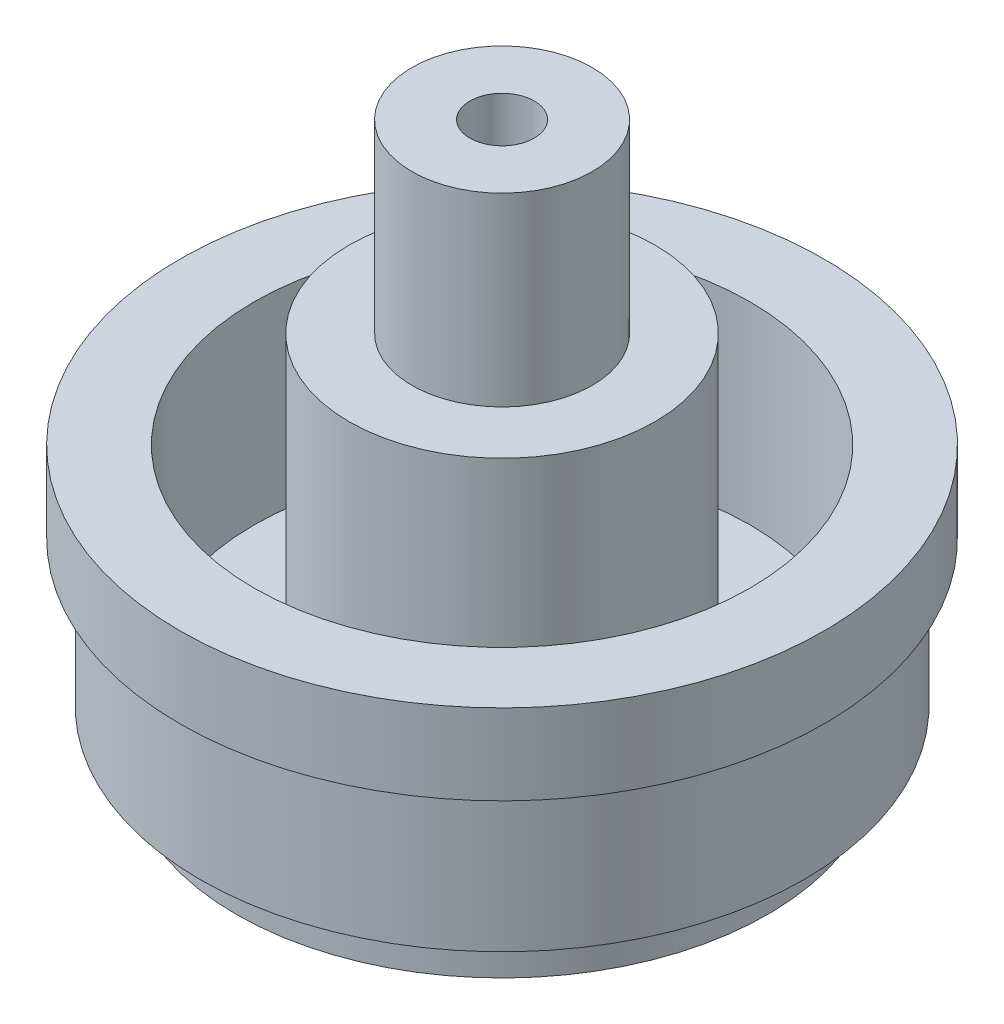
ISO-10303-21;
HEADER;
FILE_DESCRIPTION(('STEP AP214'),'2;1');
FILE_NAME('part.step','',(''),(''),'','','');
FILE_SCHEMA(('AUTOMOTIVE_DESIGN { 1 0 10303 214 1 1 1 1 }'));
ENDSEC;
DATA;
#1=APPLICATION_CONTEXT('core data for automotive mechanical design processes');
#2=APPLICATION_PROTOCOL_DEFINITION('international standard','automotive_design',2000,#1);
#3=PRODUCT_CONTEXT('',#1,'mechanical');
#4=PRODUCT('Part','Part','',(#3));
#5=PRODUCT_RELATED_PRODUCT_CATEGORY('part','',(#4));
#6=PRODUCT_DEFINITION_FORMATION('','',#4);
#7=PRODUCT_DEFINITION_CONTEXT('part definition',#1,'design');
#8=PRODUCT_DEFINITION('design','',#6,#7);
#9=PRODUCT_DEFINITION_SHAPE('','',#8);
#10=(LENGTH_UNIT() NAMED_UNIT(*) SI_UNIT(.MILLI.,.METRE.));
#11=(NAMED_UNIT(*) PLANE_ANGLE_UNIT() SI_UNIT($,.RADIAN.));
#12=(NAMED_UNIT(*) SI_UNIT($,.STERADIAN.) SOLID_ANGLE_UNIT());
#13=UNCERTAINTY_MEASURE_WITH_UNIT(LENGTH_MEASURE(1.E-05),#10,'distance_accuracy_value','');
#14=(GEOMETRIC_REPRESENTATION_CONTEXT(3) GLOBAL_UNCERTAINTY_ASSIGNED_CONTEXT((#13)) GLOBAL_UNIT_ASSIGNED_CONTEXT((#10,
#11,#12)) REPRESENTATION_CONTEXT('',''));
#15=CARTESIAN_POINT('',(0.,0.,0.));
#16=DIRECTION('',(0.,0.,1.));
#17=DIRECTION('',(1.,0.,0.));
#18=AXIS2_PLACEMENT_3D('',#15,#16,#17);
#19=CARTESIAN_POINT('',(0.,-12.7,0.));
#20=DIRECTION('',(0.,1.,0.));
#21=DIRECTION('',(0.,0.,1.));
#22=AXIS2_PLACEMENT_3D('',#19,#20,#21);
#23=CYLINDRICAL_SURFACE('',#22,50.8);
#24=CARTESIAN_POINT('',(0.,-12.7,0.));
#25=DIRECTION('',(0.,1.,0.));
#26=DIRECTION('',(0.,0.,1.));
#27=AXIS2_PLACEMENT_3D('',#24,#25,#26);
#28=CIRCLE('',#27,50.8);
#29=CARTESIAN_POINT('',(0.,-12.7,50.8));
#30=VERTEX_POINT('',#29);
#31=EDGE_CURVE('E53',#30,#30,#28,.T.);
#32=ORIENTED_EDGE('',*,*,#31,.T.);
#33=EDGE_LOOP('',(#32));
#34=FACE_BOUND('',#33,.T.);
#35=CARTESIAN_POINT('',(0.,0.,0.));
#36=DIRECTION('',(0.,1.,0.));
#37=DIRECTION('',(0.,0.,1.));
#38=AXIS2_PLACEMENT_3D('',#35,#36,#37);
#39=CIRCLE('',#38,50.8);
#40=CARTESIAN_POINT('',(0.,0.,50.8));
#41=VERTEX_POINT('',#40);
#42=EDGE_CURVE('E87',#41,#41,#39,.T.);
#43=ORIENTED_EDGE('',*,*,#42,.F.);
#44=EDGE_LOOP('',(#43));
#45=FACE_BOUND('',#44,.T.);
#46=ADVANCED_FACE('F39',(#34,#45),#23,.T.);
#47=CARTESIAN_POINT('',(0.,-12.7,0.));
#48=DIRECTION('',(0.,1.,0.));
#49=DIRECTION('',(0.,0.,1.));
#50=AXIS2_PLACEMENT_3D('',#47,#48,#49);
#51=PLANE('',#50);
#52=CARTESIAN_POINT('',(0.,-12.7,0.));
#53=DIRECTION('',(0.,1.,0.));
#54=DIRECTION('',(0.,0.,1.));
#55=AXIS2_PLACEMENT_3D('',#52,#53,#54);
#56=CIRCLE('',#55,47.625);
#57=CARTESIAN_POINT('',(0.,-12.7,47.625));
#58=VERTEX_POINT('',#57);
#59=EDGE_CURVE('E47',#58,#58,#56,.F.);
#60=ORIENTED_EDGE('',*,*,#59,.F.);
#61=EDGE_LOOP('',(#60));
#62=FACE_BOUND('',#61,.T.);
#63=ORIENTED_EDGE('',*,*,#31,.F.);
#64=EDGE_LOOP('',(#63));
#65=FACE_BOUND('',#64,.T.);
#66=ADVANCED_FACE('F128',(#62,#65),#51,.F.);
#67=CARTESIAN_POINT('',(0.,0.,0.));
#68=DIRECTION('',(0.,1.,0.));
#69=DIRECTION('',(0.,0.,1.));
#70=AXIS2_PLACEMENT_3D('',#67,#68,#69);
#71=PLANE('',#70);
#72=CARTESIAN_POINT('',(0.,0.,0.));
#73=DIRECTION('',(0.,1.,0.));
#74=DIRECTION('',(0.,0.,1.));
#75=AXIS2_PLACEMENT_3D('',#72,#73,#74);
#76=CIRCLE('',#75,39.116);
#77=CARTESIAN_POINT('',(0.,0.,39.116));
#78=VERTEX_POINT('',#77);
#79=EDGE_CURVE('E83',#78,#78,#76,.T.);
#80=ORIENTED_EDGE('',*,*,#79,.F.);
#81=EDGE_LOOP('',(#80));
#82=FACE_BOUND('',#81,.T.);
#83=ORIENTED_EDGE('',*,*,#42,.T.);
#84=EDGE_LOOP('',(#83));
#85=FACE_BOUND('',#84,.T.);
#86=ADVANCED_FACE('F133',(#82,#85),#71,.T.);
#87=CARTESIAN_POINT('',(0.,-12.7,0.));
#88=DIRECTION('',(0.,1.,0.));
#89=DIRECTION('',(0.,0.,1.));
#90=AXIS2_PLACEMENT_3D('',#87,#88,#89);
#91=CYLINDRICAL_SURFACE('',#90,39.116);
#92=ORIENTED_EDGE('',*,*,#79,.T.);
#93=EDGE_LOOP('',(#92));
#94=FACE_BOUND('',#93,.T.);
#95=CARTESIAN_POINT('',(0.,-30.48,0.));
#96=DIRECTION('',(0.,1.,0.));
#97=DIRECTION('',(0.,0.,1.));
#98=AXIS2_PLACEMENT_3D('',#95,#96,#97);
#99=CIRCLE('',#98,39.116);
#100=CARTESIAN_POINT('',(0.,-30.48,39.116));
#101=VERTEX_POINT('',#100);
#102=EDGE_CURVE('E75',#101,#101,#99,.T.);
#103=ORIENTED_EDGE('',*,*,#102,.F.);
#104=EDGE_LOOP('',(#103));
#105=FACE_BOUND('',#104,.T.);
#106=ADVANCED_FACE('F141',(#94,#105),#91,.F.);
#107=CARTESIAN_POINT('',(0.,-43.18,0.));
#108=DIRECTION('',(0.,1.,0.));
#109=DIRECTION('',(0.,0.,1.));
#110=AXIS2_PLACEMENT_3D('',#107,#108,#109);
#111=PLANE('',#110);
#112=CARTESIAN_POINT('',(0.,-43.18,0.));
#113=DIRECTION('',(0.,1.,0.));
#114=DIRECTION('',(0.,0.,1.));
#115=AXIS2_PLACEMENT_3D('',#112,#113,#114);
#116=CIRCLE('',#115,16.51);
#117=CARTESIAN_POINT('',(0.,-43.18,16.51));
#118=VERTEX_POINT('',#117);
#119=EDGE_CURVE('E93',#118,#118,#116,.T.);
#120=ORIENTED_EDGE('',*,*,#119,.T.);
#121=EDGE_LOOP('',(#120));
#122=FACE_BOUND('',#121,.T.);
#123=CARTESIAN_POINT('',(0.,-43.18,0.));
#124=DIRECTION('',(0.,1.,0.));
#125=DIRECTION('',(0.,0.,1.));
#126=AXIS2_PLACEMENT_3D('',#123,#124,#125);
#127=CIRCLE('',#126,41.91);
#128=CARTESIAN_POINT('',(0.,-43.18,41.91));
#129=VERTEX_POINT('',#128);
#130=EDGE_CURVE('E63',#129,#129,#127,.T.);
#131=ORIENTED_EDGE('',*,*,#130,.F.);
#132=EDGE_LOOP('',(#131));
#133=FACE_BOUND('',#132,.T.);
#134=ADVANCED_FACE('F146',(#122,#133),#111,.F.);
#135=CARTESIAN_POINT('',(0.,-43.18,0.));
#136=DIRECTION('',(0.,1.,0.));
#137=DIRECTION('',(0.,0.,1.));
#138=AXIS2_PLACEMENT_3D('',#135,#136,#137);
#139=CYLINDRICAL_SURFACE('',#138,41.91);
#140=CARTESIAN_POINT('',(0.,-35.56,0.));
#141=DIRECTION('',(0.,-1.,0.));
#142=DIRECTION('',(0.,0.,-1.));
#143=AXIS2_PLACEMENT_3D('',#140,#141,#142);
#144=CIRCLE('',#143,41.91);
#145=CARTESIAN_POINT('',(0.,-35.56,-41.91));
#146=VERTEX_POINT('',#145);
#147=EDGE_CURVE('E79',#146,#146,#144,.T.);
#148=ORIENTED_EDGE('',*,*,#147,.T.);
#149=EDGE_LOOP('',(#148));
#150=FACE_BOUND('',#149,.T.);
#151=ORIENTED_EDGE('',*,*,#130,.T.);
#152=EDGE_LOOP('',(#151));
#153=FACE_BOUND('',#152,.T.);
#154=ADVANCED_FACE('F155',(#150,#153),#139,.T.);
#155=CARTESIAN_POINT('',(0.,-35.56,0.));
#156=DIRECTION('',(0.,1.,0.));
#157=DIRECTION('',(0.,0.,1.));
#158=AXIS2_PLACEMENT_3D('',#155,#156,#157);
#159=CYLINDRICAL_SURFACE('',#158,47.625);
#160=CARTESIAN_POINT('',(0.,-35.56,0.));
#161=DIRECTION('',(0.,-1.,0.));
#162=DIRECTION('',(0.,0.,-1.));
#163=AXIS2_PLACEMENT_3D('',#160,#161,#162);
#164=CIRCLE('',#163,47.625);
#165=CARTESIAN_POINT('',(0.,-35.56,-47.625));
#166=VERTEX_POINT('',#165);
#167=EDGE_CURVE('E70',#166,#166,#164,.T.);
#168=ORIENTED_EDGE('',*,*,#167,.F.);
#169=EDGE_LOOP('',(#168));
#170=FACE_BOUND('',#169,.T.);
#171=ORIENTED_EDGE('',*,*,#59,.T.);
#172=EDGE_LOOP('',(#171));
#173=FACE_BOUND('',#172,.T.);
#174=ADVANCED_FACE('F151',(#170,#173),#159,.T.);
#175=CARTESIAN_POINT('',(0.,-35.56,0.));
#176=DIRECTION('',(0.,-1.,0.));
#177=DIRECTION('',(0.,0.,-1.));
#178=AXIS2_PLACEMENT_3D('',#175,#176,#177);
#179=PLANE('',#178);
#180=ORIENTED_EDGE('',*,*,#147,.F.);
#181=EDGE_LOOP('',(#180));
#182=FACE_BOUND('',#181,.T.);
#183=ORIENTED_EDGE('',*,*,#167,.T.);
#184=EDGE_LOOP('',(#183));
#185=FACE_BOUND('',#184,.T.);
#186=ADVANCED_FACE('F154',(#182,#185),#179,.T.);
#187=CARTESIAN_POINT('',(0.,-30.48,0.));
#188=DIRECTION('',(0.,1.,0.));
#189=DIRECTION('',(0.,0.,1.));
#190=AXIS2_PLACEMENT_3D('',#187,#188,#189);
#191=PLANE('',#190);
#192=CARTESIAN_POINT('',(0.,-30.48,0.));
#193=DIRECTION('',(0.,1.,0.));
#194=DIRECTION('',(0.,0.,1.));
#195=AXIS2_PLACEMENT_3D('',#192,#193,#194);
#196=CIRCLE('',#195,24.13);
#197=CARTESIAN_POINT('',(0.,-30.48,24.13));
#198=VERTEX_POINT('',#197);
#199=EDGE_CURVE('E64',#198,#198,#196,.T.);
#200=ORIENTED_EDGE('',*,*,#199,.F.);
#201=EDGE_LOOP('',(#200));
#202=FACE_BOUND('',#201,.T.);
#203=ORIENTED_EDGE('',*,*,#102,.T.);
#204=EDGE_LOOP('',(#203));
#205=FACE_BOUND('',#204,.T.);
#206=ADVANCED_FACE('F159',(#202,#205),#191,.T.);
#207=CARTESIAN_POINT('',(0.,15.24,0.));
#208=DIRECTION('',(0.,-1.,0.));
#209=DIRECTION('',(0.,0.,-1.));
#210=AXIS2_PLACEMENT_3D('',#207,#208,#209);
#211=CYLINDRICAL_SURFACE('',#210,24.13);
#212=CARTESIAN_POINT('',(0.,15.24,0.));
#213=DIRECTION('',(0.,1.,0.));
#214=DIRECTION('',(0.,0.,1.));
#215=AXIS2_PLACEMENT_3D('',#212,#213,#214);
#216=CIRCLE('',#215,24.13);
#217=CARTESIAN_POINT('',(0.,15.24,24.13));
#218=VERTEX_POINT('',#217);
#219=EDGE_CURVE('E59',#218,#218,#216,.T.);
#220=ORIENTED_EDGE('',*,*,#219,.F.);
#221=EDGE_LOOP('',(#220));
#222=FACE_BOUND('',#221,.T.);
#223=ORIENTED_EDGE('',*,*,#199,.T.);
#224=EDGE_LOOP('',(#223));
#225=FACE_BOUND('',#224,.T.);
#226=ADVANCED_FACE('F168',(#222,#225),#211,.T.);
#227=CARTESIAN_POINT('',(0.,15.24,0.));
#228=DIRECTION('',(0.,1.,0.));
#229=DIRECTION('',(0.,0.,1.));
#230=AXIS2_PLACEMENT_3D('',#227,#228,#229);
#231=PLANE('',#230);
#232=CARTESIAN_POINT('',(0.,15.24,0.));
#233=DIRECTION('',(0.,1.,0.));
#234=DIRECTION('',(0.,0.,1.));
#235=AXIS2_PLACEMENT_3D('',#232,#233,#234);
#236=CIRCLE('',#235,14.224);
#237=CARTESIAN_POINT('',(0.,15.24,-14.224));
#238=VERTEX_POINT('',#237);
#239=EDGE_CURVE('E11',#238,#238,#236,.T.);
#240=ORIENTED_EDGE('',*,*,#239,.F.);
#241=EDGE_LOOP('',(#240));
#242=FACE_BOUND('',#241,.T.);
#243=ORIENTED_EDGE('',*,*,#219,.T.);
#244=EDGE_LOOP('',(#243));
#245=FACE_BOUND('',#244,.T.);
#246=ADVANCED_FACE('F172',(#242,#245),#231,.T.);
#247=CARTESIAN_POINT('',(0.,44.45,0.));
#248=DIRECTION('',(0.,-1.,0.));
#249=DIRECTION('',(0.,0.,-1.));
#250=AXIS2_PLACEMENT_3D('',#247,#248,#249);
#251=CYLINDRICAL_SURFACE('',#250,14.224);
#252=CARTESIAN_POINT('',(0.,44.45,0.));
#253=DIRECTION('',(0.,1.,0.));
#254=DIRECTION('',(0.,0.,1.));
#255=AXIS2_PLACEMENT_3D('',#252,#253,#254);
#256=CIRCLE('',#255,14.224);
#257=CARTESIAN_POINT('',(0.,44.45,-14.224));
#258=VERTEX_POINT('',#257);
#259=EDGE_CURVE('E57',#258,#258,#256,.T.);
#260=CARTESIAN_POINT('',(0.,44.45,-14.224));
#261=CARTESIAN_POINT('',(0.,44.1457291666667,-14.224));
#262=CARTESIAN_POINT('',(0.,43.8414583333333,-14.224));
#263=CARTESIAN_POINT('',(0.,43.2329166666667,-14.224));
#264=CARTESIAN_POINT('',(0.,42.9286458333333,-14.224));
#265=CARTESIAN_POINT('',(0.,42.3201041666667,-14.224));
#266=CARTESIAN_POINT('',(0.,42.0158333333333,-14.224));
#267=CARTESIAN_POINT('',(0.,41.4072916666667,-14.224));
#268=CARTESIAN_POINT('',(0.,41.1030208333333,-14.224));
#269=CARTESIAN_POINT('',(0.,40.4944791666667,-14.224));
#270=CARTESIAN_POINT('',(0.,40.1902083333333,-14.224));
#271=CARTESIAN_POINT('',(0.,39.5816666666667,-14.224));
#272=CARTESIAN_POINT('',(0.,39.2773958333333,-14.224));
#273=CARTESIAN_POINT('',(0.,38.6688541666667,-14.224));
#274=CARTESIAN_POINT('',(0.,38.3645833333333,-14.224));
#275=CARTESIAN_POINT('',(0.,37.7560416666667,-14.224));
#276=CARTESIAN_POINT('',(0.,37.4517708333333,-14.224));
#277=CARTESIAN_POINT('',(0.,36.8432291666667,-14.224));
#278=CARTESIAN_POINT('',(0.,36.5389583333333,-14.224));
#279=CARTESIAN_POINT('',(0.,35.9304166666667,-14.224));
#280=CARTESIAN_POINT('',(0.,35.6261458333333,-14.224));
#281=CARTESIAN_POINT('',(0.,35.0176041666667,-14.224));
#282=CARTESIAN_POINT('',(0.,34.7133333333333,-14.224));
#283=CARTESIAN_POINT('',(0.,34.1047916666667,-14.224));
#284=CARTESIAN_POINT('',(0.,33.8005208333333,-14.224));
#285=CARTESIAN_POINT('',(0.,33.1919791666667,-14.224));
#286=CARTESIAN_POINT('',(0.,32.8877083333333,-14.224));
#287=CARTESIAN_POINT('',(0.,32.2791666666667,-14.224));
#288=CARTESIAN_POINT('',(0.,31.9748958333333,-14.224));
#289=CARTESIAN_POINT('',(0.,31.3663541666667,-14.224));
#290=CARTESIAN_POINT('',(0.,31.0620833333333,-14.224));
#291=CARTESIAN_POINT('',(0.,30.4535416666667,-14.224));
#292=CARTESIAN_POINT('',(0.,30.1492708333333,-14.224));
#293=CARTESIAN_POINT('',(0.,29.5407291666667,-14.224));
#294=CARTESIAN_POINT('',(0.,29.2364583333333,-14.224));
#295=CARTESIAN_POINT('',(0.,28.6279166666667,-14.224));
#296=CARTESIAN_POINT('',(0.,28.3236458333333,-14.224));
#297=CARTESIAN_POINT('',(0.,27.7151041666667,-14.224));
#298=CARTESIAN_POINT('',(0.,27.4108333333333,-14.224));
#299=CARTESIAN_POINT('',(0.,26.8022916666667,-14.224));
#300=CARTESIAN_POINT('',(0.,26.4980208333333,-14.224));
#301=CARTESIAN_POINT('',(0.,25.8894791666667,-14.224));
#302=CARTESIAN_POINT('',(0.,25.5852083333333,-14.224));
#303=CARTESIAN_POINT('',(0.,24.9766666666667,-14.224));
#304=CARTESIAN_POINT('',(0.,24.6723958333333,-14.224));
#305=CARTESIAN_POINT('',(0.,24.0638541666667,-14.224));
#306=CARTESIAN_POINT('',(0.,23.7595833333333,-14.224));
#307=CARTESIAN_POINT('',(0.,23.1510416666667,-14.224));
#308=CARTESIAN_POINT('',(0.,22.8467708333333,-14.224));
#309=CARTESIAN_POINT('',(0.,22.2382291666667,-14.224));
#310=CARTESIAN_POINT('',(0.,21.9339583333333,-14.224));
#311=CARTESIAN_POINT('',(0.,21.3254166666667,-14.224));
#312=CARTESIAN_POINT('',(0.,21.0211458333333,-14.224));
#313=CARTESIAN_POINT('',(0.,20.4126041666667,-14.224));
#314=CARTESIAN_POINT('',(0.,20.1083333333333,-14.224));
#315=CARTESIAN_POINT('',(0.,19.4997916666667,-14.224));
#316=CARTESIAN_POINT('',(0.,19.1955208333333,-14.224));
#317=CARTESIAN_POINT('',(0.,18.5869791666667,-14.224));
#318=CARTESIAN_POINT('',(0.,18.2827083333333,-14.224));
#319=CARTESIAN_POINT('',(0.,17.6741666666667,-14.224));
#320=CARTESIAN_POINT('',(0.,17.3698958333333,-14.224));
#321=CARTESIAN_POINT('',(0.,16.7613541666667,-14.224));
#322=CARTESIAN_POINT('',(0.,16.4570833333333,-14.224));
#323=CARTESIAN_POINT('',(0.,15.8485416666667,-14.224));
#324=CARTESIAN_POINT('',(0.,15.5442708333333,-14.224));
#325=CARTESIAN_POINT('',(0.,15.24,-14.224));
#326=B_SPLINE_CURVE_WITH_KNOTS('',3,(#260,#261,#262,#263,#264,#265,#266,#267,#268,#269,#270,
#271,#272,#273,#274,#275,#276,#277,#278,#279,#280,#281,#282,#283,#284,#285,#286,#287,#288,#289,
#290,#291,#292,#293,#294,#295,#296,#297,#298,#299,#300,#301,#302,#303,#304,#305,#306,#307,#308,
#309,#310,#311,#312,#313,#314,#315,#316,#317,#318,#319,#320,#321,#322,#323,#324,#325),
.UNSPECIFIED.,.F.,.F.,(4,2,2,2,2,2,2,2,2,2,2,2,2,2,2,2,2,2,2,2,2,2,2,2,2,2,2,2,2,2,2,2,4),(0.,
0.912812500000006,1.825625,2.7384375,3.65125,4.5640625,5.476875,6.3896875,7.3025,8.2153125,
9.128125,10.0409375,10.95375,11.8665625,12.779375,13.6921875,14.605,15.5178125,16.430625,
17.3434375,18.25625,19.1690625,20.081875,20.9946875,21.9075,22.8203125,23.733125,24.6459375,
25.55875,26.4715625,27.384375,28.2971875,29.21),.UNSPECIFIED.);
#327=EDGE_CURVE('BSEAM176',#258,#238,#326,.T.);
#328=ORIENTED_EDGE('',*,*,#259,.F.);
#329=ORIENTED_EDGE('',*,*,#239,.T.);
#330=ORIENTED_EDGE('',*,*,#327,.T.);
#331=ORIENTED_EDGE('',*,*,#327,.F.);
#332=EDGE_LOOP('',(#328,#330,#329,#331));
#333=FACE_BOUND('',#332,.T.);
#334=ADVANCED_FACE('F176',(#333),#251,.T.);
#335=CARTESIAN_POINT('',(0.,44.45,0.));
#336=DIRECTION('',(0.,1.,0.));
#337=DIRECTION('',(0.,0.,1.));
#338=AXIS2_PLACEMENT_3D('',#335,#336,#337);
#339=PLANE('',#338);
#340=CARTESIAN_POINT('',(0.,44.45,0.));
#341=DIRECTION('',(0.,1.,0.));
#342=DIRECTION('',(0.,0.,1.));
#343=AXIS2_PLACEMENT_3D('',#340,#341,#342);
#344=CIRCLE('',#343,5.08);
#345=CARTESIAN_POINT('',(0.,44.45,5.08));
#346=VERTEX_POINT('',#345);
#347=EDGE_CURVE('E42',#346,#346,#344,.T.);
#348=ORIENTED_EDGE('',*,*,#347,.F.);
#349=EDGE_LOOP('',(#348));
#350=FACE_BOUND('',#349,.T.);
#351=ORIENTED_EDGE('',*,*,#259,.T.);
#352=EDGE_LOOP('',(#351));
#353=FACE_BOUND('',#352,.T.);
#354=ADVANCED_FACE('F180',(#350,#353),#339,.T.);
#355=CARTESIAN_POINT('',(0.,5.07999999999999,0.));
#356=DIRECTION('',(0.,-1.,0.));
#357=DIRECTION('',(0.,0.,-1.));
#358=AXIS2_PLACEMENT_3D('',#355,#356,#357);
#359=CYLINDRICAL_SURFACE('',#358,16.51);
#360=CARTESIAN_POINT('',(0.,5.07999999999999,0.));
#361=DIRECTION('',(0.,-1.,0.));
#362=DIRECTION('',(0.,0.,-1.));
#363=AXIS2_PLACEMENT_3D('',#360,#361,#362);
#364=CIRCLE('',#363,16.51);
#365=CARTESIAN_POINT('',(0.,5.07999999999999,-16.51));
#366=VERTEX_POINT('',#365);
#367=EDGE_CURVE('E96',#366,#366,#364,.T.);
#368=ORIENTED_EDGE('',*,*,#367,.F.);
#369=EDGE_LOOP('',(#368));
#370=FACE_BOUND('',#369,.T.);
#371=ORIENTED_EDGE('',*,*,#119,.F.);
#372=EDGE_LOOP('',(#371));
#373=FACE_BOUND('',#372,.T.);
#374=ADVANCED_FACE('F125',(#370,#373),#359,.F.);
#375=CARTESIAN_POINT('',(0.,5.07999999999999,0.));
#376=DIRECTION('',(0.,-1.,0.));
#377=DIRECTION('',(0.,0.,-1.));
#378=AXIS2_PLACEMENT_3D('',#375,#376,#377);
#379=PLANE('',#378);
#380=ORIENTED_EDGE('',*,*,#367,.T.);
#381=EDGE_LOOP('',(#380));
#382=FACE_BOUND('',#381,.T.);
#383=ADVANCED_FACE('F117',(#382),#379,.T.);
#384=CARTESIAN_POINT('',(0.,20.574,0.));
#385=DIRECTION('',(0.,1.,0.));
#386=DIRECTION('',(0.,0.,1.));
#387=AXIS2_PLACEMENT_3D('',#384,#385,#386);
#388=CYLINDRICAL_SURFACE('',#387,5.08);
#389=CARTESIAN_POINT('',(0.,20.574,0.));
#390=DIRECTION('',(0.,1.,0.));
#391=DIRECTION('',(0.,0.,1.));
#392=AXIS2_PLACEMENT_3D('',#389,#390,#391);
#393=CIRCLE('',#392,5.08);
#394=CARTESIAN_POINT('',(0.,20.574,5.08));
#395=VERTEX_POINT('',#394);
#396=EDGE_CURVE('E107',#395,#395,#393,.T.);
#397=CARTESIAN_POINT('',(0.,44.45,5.08));
#398=CARTESIAN_POINT('',(0.,44.2012916666667,5.08));
#399=CARTESIAN_POINT('',(0.,43.9525833333333,5.08));
#400=CARTESIAN_POINT('',(0.,43.4551666666667,5.08));
#401=CARTESIAN_POINT('',(0.,43.2064583333333,5.08));
#402=CARTESIAN_POINT('',(0.,42.7090416666667,5.08));
#403=CARTESIAN_POINT('',(0.,42.4603333333333,5.08));
#404=CARTESIAN_POINT('',(0.,41.9629166666667,5.08));
#405=CARTESIAN_POINT('',(0.,41.7142083333333,5.08));
#406=CARTESIAN_POINT('',(0.,41.2167916666667,5.08));
#407=CARTESIAN_POINT('',(0.,40.9680833333333,5.08));
#408=CARTESIAN_POINT('',(0.,40.4706666666667,5.08));
#409=CARTESIAN_POINT('',(0.,40.2219583333333,5.08));
#410=CARTESIAN_POINT('',(0.,39.7245416666667,5.08));
#411=CARTESIAN_POINT('',(0.,39.4758333333333,5.08));
#412=CARTESIAN_POINT('',(0.,38.9784166666667,5.08));
#413=CARTESIAN_POINT('',(0.,38.7297083333333,5.08));
#414=CARTESIAN_POINT('',(0.,38.2322916666667,5.08));
#415=CARTESIAN_POINT('',(0.,37.9835833333333,5.08));
#416=CARTESIAN_POINT('',(0.,37.4861666666667,5.08));
#417=CARTESIAN_POINT('',(0.,37.2374583333333,5.08));
#418=CARTESIAN_POINT('',(0.,36.7400416666667,5.08));
#419=CARTESIAN_POINT('',(0.,36.4913333333333,5.08));
#420=CARTESIAN_POINT('',(0.,35.9939166666667,5.08));
#421=CARTESIAN_POINT('',(0.,35.7452083333333,5.08));
#422=CARTESIAN_POINT('',(0.,35.2477916666667,5.08));
#423=CARTESIAN_POINT('',(0.,34.9990833333333,5.08));
#424=CARTESIAN_POINT('',(0.,34.5016666666667,5.08));
#425=CARTESIAN_POINT('',(0.,34.2529583333333,5.08));
#426=CARTESIAN_POINT('',(0.,33.7555416666667,5.08));
#427=CARTESIAN_POINT('',(0.,33.5068333333333,5.08));
#428=CARTESIAN_POINT('',(0.,33.0094166666667,5.08));
#429=CARTESIAN_POINT('',(0.,32.7607083333333,5.08));
#430=CARTESIAN_POINT('',(0.,32.2632916666667,5.08));
#431=CARTESIAN_POINT('',(0.,32.0145833333333,5.08));
#432=CARTESIAN_POINT('',(0.,31.5171666666667,5.08));
#433=CARTESIAN_POINT('',(0.,31.2684583333333,5.08));
#434=CARTESIAN_POINT('',(0.,30.7710416666667,5.08));
#435=CARTESIAN_POINT('',(0.,30.5223333333333,5.08));
#436=CARTESIAN_POINT('',(0.,30.0249166666667,5.08));
#437=CARTESIAN_POINT('',(0.,29.7762083333333,5.08));
#438=CARTESIAN_POINT('',(0.,29.2787916666667,5.08));
#439=CARTESIAN_POINT('',(0.,29.0300833333333,5.08));
#440=CARTESIAN_POINT('',(0.,28.5326666666667,5.08));
#441=CARTESIAN_POINT('',(0.,28.2839583333333,5.08));
#442=CARTESIAN_POINT('',(0.,27.7865416666667,5.08));
#443=CARTESIAN_POINT('',(0.,27.5378333333333,5.08));
#444=CARTESIAN_POINT('',(0.,27.0404166666667,5.08));
#445=CARTESIAN_POINT('',(0.,26.7917083333333,5.08));
#446=CARTESIAN_POINT('',(0.,26.2942916666667,5.08));
#447=CARTESIAN_POINT('',(0.,26.0455833333333,5.08));
#448=CARTESIAN_POINT('',(0.,25.5481666666667,5.08));
#449=CARTESIAN_POINT('',(0.,25.2994583333333,5.08));
#450=CARTESIAN_POINT('',(0.,24.8020416666667,5.08));
#451=CARTESIAN_POINT('',(0.,24.5533333333333,5.08));
#452=CARTESIAN_POINT('',(0.,24.0559166666667,5.08));
#453=CARTESIAN_POINT('',(0.,23.8072083333333,5.08));
#454=CARTESIAN_POINT('',(0.,23.3097916666667,5.08));
#455=CARTESIAN_POINT('',(0.,23.0610833333333,5.08));
#456=CARTESIAN_POINT('',(0.,22.5636666666667,5.08));
#457=CARTESIAN_POINT('',(0.,22.3149583333333,5.08));
#458=CARTESIAN_POINT('',(0.,21.8175416666667,5.08));
#459=CARTESIAN_POINT('',(0.,21.5688333333333,5.08));
#460=CARTESIAN_POINT('',(0.,21.0714166666667,5.08));
#461=CARTESIAN_POINT('',(0.,20.8227083333333,5.08));
#462=CARTESIAN_POINT('',(0.,20.574,5.08));
#463=B_SPLINE_CURVE_WITH_KNOTS('',3,(#397,#398,#399,#400,#401,#402,#403,#404,#405,#406,#407,
#408,#409,#410,#411,#412,#413,#414,#415,#416,#417,#418,#419,#420,#421,#422,#423,#424,#425,#426,
#427,#428,#429,#430,#431,#432,#433,#434,#435,#436,#437,#438,#439,#440,#441,#442,#443,#444,#445,
#446,#447,#448,#449,#450,#451,#452,#453,#454,#455,#456,#457,#458,#459,#460,#461,#462),
.UNSPECIFIED.,.F.,.F.,(4,2,2,2,2,2,2,2,2,2,2,2,2,2,2,2,2,2,2,2,2,2,2,2,2,2,2,2,2,2,2,2,4),(0.,
0.746125,1.49225,2.238375,2.9845,3.730625,4.47675,5.222875,5.969,6.715125,7.46125,8.207375,
8.9535,9.699625,10.44575,11.191875,11.938,12.684125,13.43025,14.176375,14.9225,15.668625,
16.41475,17.160875,17.907,18.653125,19.39925,20.145375,20.8915,21.637625,22.38375,23.129875,
23.876),.UNSPECIFIED.);
#464=EDGE_CURVE('BSEAM115',#346,#395,#463,.T.);
#465=ORIENTED_EDGE('',*,*,#347,.T.);
#466=ORIENTED_EDGE('',*,*,#396,.F.);
#467=ORIENTED_EDGE('',*,*,#464,.T.);
#468=ORIENTED_EDGE('',*,*,#464,.F.);
#469=EDGE_LOOP('',(#465,#467,#466,#468));
#470=FACE_BOUND('',#469,.T.);
#471=ADVANCED_FACE('F115',(#470),#388,.F.);
#472=CARTESIAN_POINT('',(0.,20.574,0.));
#473=DIRECTION('',(0.,1.,0.));
#474=DIRECTION('',(0.,0.,1.));
#475=AXIS2_PLACEMENT_3D('',#472,#473,#474);
#476=PLANE('',#475);
#477=ORIENTED_EDGE('',*,*,#396,.T.);
#478=EDGE_LOOP('',(#477));
#479=FACE_BOUND('',#478,.T.);
#480=ADVANCED_FACE('F113',(#479),#476,.T.);
#481=CLOSED_SHELL('',(#46,#66,#86,#106,#134,#154,#174,#186,#206,#226,#246,#334,#354,#374,#383,
#471,#480));
#482=MANIFOLD_SOLID_BREP('B2',#481);
#483=ADVANCED_BREP_SHAPE_REPRESENTATION('',(#18,#482),#14);
#484=SHAPE_DEFINITION_REPRESENTATION(#9,#483);
ENDSEC;
END-ISO-10303-21;
